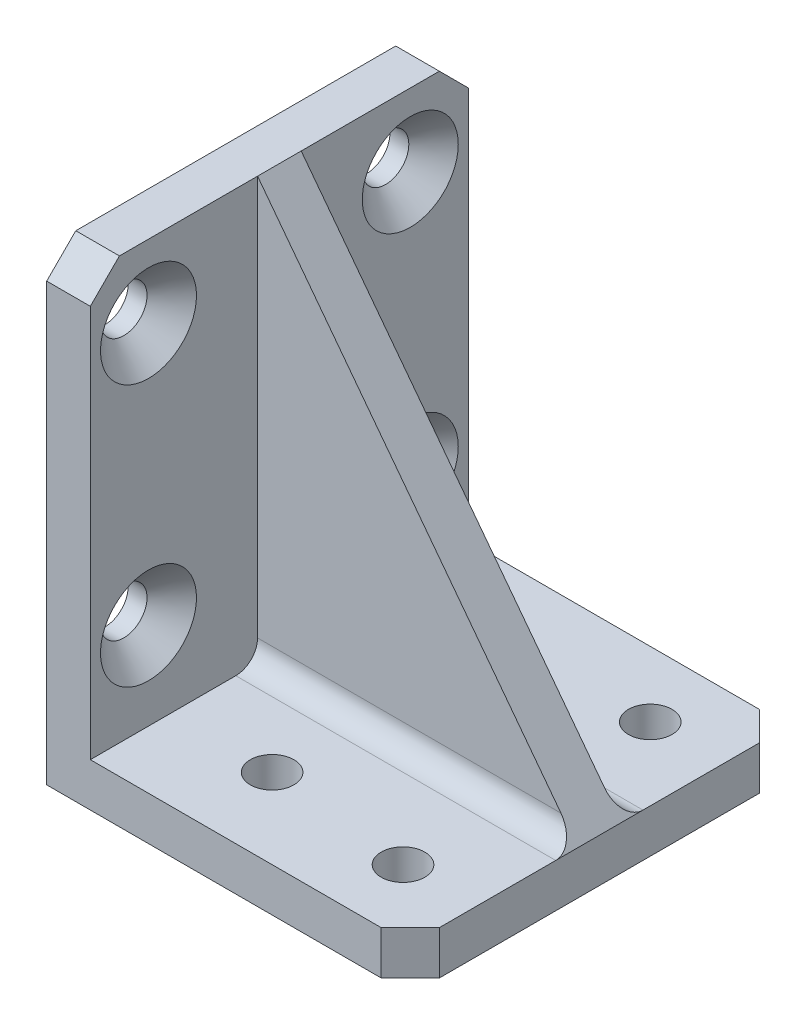
ISO-10303-21;
HEADER;
FILE_DESCRIPTION(('STEP AP214'),'2;1');
FILE_NAME('part.step','',(''),(''),'','','');
FILE_SCHEMA(('AUTOMOTIVE_DESIGN { 1 0 10303 214 1 1 1 1 }'));
ENDSEC;
DATA;
#1=APPLICATION_CONTEXT('core data for automotive mechanical design processes');
#2=APPLICATION_PROTOCOL_DEFINITION('international standard','automotive_design',2000,#1);
#3=PRODUCT_CONTEXT('',#1,'mechanical');
#4=PRODUCT('Part','Part','',(#3));
#5=PRODUCT_RELATED_PRODUCT_CATEGORY('part','',(#4));
#6=PRODUCT_DEFINITION_FORMATION('','',#4);
#7=PRODUCT_DEFINITION_CONTEXT('part definition',#1,'design');
#8=PRODUCT_DEFINITION('design','',#6,#7);
#9=PRODUCT_DEFINITION_SHAPE('','',#8);
#10=(LENGTH_UNIT() NAMED_UNIT(*) SI_UNIT(.MILLI.,.METRE.));
#11=(NAMED_UNIT(*) PLANE_ANGLE_UNIT() SI_UNIT($,.RADIAN.));
#12=(NAMED_UNIT(*) SI_UNIT($,.STERADIAN.) SOLID_ANGLE_UNIT());
#13=UNCERTAINTY_MEASURE_WITH_UNIT(LENGTH_MEASURE(1.E-05),#10,'distance_accuracy_value','');
#14=(GEOMETRIC_REPRESENTATION_CONTEXT(3) GLOBAL_UNCERTAINTY_ASSIGNED_CONTEXT((#13)) GLOBAL_UNIT_ASSIGNED_CONTEXT((#10,
#11,#12)) REPRESENTATION_CONTEXT('',''));
#15=CARTESIAN_POINT('',(0.,0.,0.));
#16=DIRECTION('',(0.,0.,1.));
#17=DIRECTION('',(1.,0.,0.));
#18=AXIS2_PLACEMENT_3D('',#15,#16,#17);
#19=CARTESIAN_POINT('',(25.,3.,13.));
#20=DIRECTION('',(0.,-1.,0.));
#21=DIRECTION('',(1.,0.,0.));
#22=AXIS2_PLACEMENT_3D('',#19,#20,#21);
#23=PLANE('',#22);
#24=CARTESIAN_POINT('',(20.,3.,8.5));
#25=DIRECTION('',(0.,-1.,0.));
#26=DIRECTION('',(1.,0.,0.));
#27=AXIS2_PLACEMENT_3D('',#24,#25,#26);
#28=CIRCLE('',#27,1.5);
#29=CARTESIAN_POINT('',(21.5,3.,8.5));
#30=VERTEX_POINT('',#29);
#31=EDGE_CURVE('E134',#30,#30,#28,.F.);
#32=ORIENTED_EDGE('',*,*,#31,.F.);
#33=EDGE_LOOP('',(#32));
#34=FACE_BOUND('',#33,.T.);
#35=CARTESIAN_POINT('',(10.,3.,7.5));
#36=DIRECTION('',(0.,-1.,0.));
#37=DIRECTION('',(1.,0.,0.));
#38=AXIS2_PLACEMENT_3D('',#35,#36,#37);
#39=CIRCLE('',#38,1.5);
#40=CARTESIAN_POINT('',(11.5,3.,7.5));
#41=VERTEX_POINT('',#40);
#42=EDGE_CURVE('E140',#41,#41,#39,.F.);
#43=ORIENTED_EDGE('',*,*,#42,.F.);
#44=EDGE_LOOP('',(#43));
#45=FACE_BOUND('',#44,.T.);
#46=DIRECTION('',(0.,0.,-1.));
#47=VECTOR('',#46,1.);
#48=CARTESIAN_POINT('',(25.,3.,13.));
#49=LINE('',#48,#47);
#50=CARTESIAN_POINT('',(25.,3.,11.));
#51=VERTEX_POINT('',#50);
#52=CARTESIAN_POINT('',(25.,3.,3.));
#53=VERTEX_POINT('',#52);
#54=EDGE_CURVE('E182',#51,#53,#49,.T.);
#55=ORIENTED_EDGE('',*,*,#54,.T.);
#56=DIRECTION('',(1.,0.,0.));
#57=VECTOR('',#56,1.);
#58=CARTESIAN_POINT('',(3.,3.,3.));
#59=LINE('',#58,#57);
#60=CARTESIAN_POINT('',(3.,3.,3.));
#61=VERTEX_POINT('',#60);
#62=EDGE_CURVE('E57',#53,#61,#59,.F.);
#63=ORIENTED_EDGE('',*,*,#62,.T.);
#64=DIRECTION('',(0.,0.,-1.));
#65=VECTOR('',#64,1.);
#66=CARTESIAN_POINT('',(3.,3.,13.));
#67=LINE('',#66,#65);
#68=CARTESIAN_POINT('',(3.,3.,13.));
#69=VERTEX_POINT('',#68);
#70=EDGE_CURVE('E179',#69,#61,#67,.T.);
#71=ORIENTED_EDGE('',*,*,#70,.F.);
#72=DIRECTION('',(-1.,0.,0.));
#73=VECTOR('',#72,1.);
#74=CARTESIAN_POINT('',(25.,3.,13.));
#75=LINE('',#74,#73);
#76=CARTESIAN_POINT('',(23.,3.,13.));
#77=VERTEX_POINT('',#76);
#78=EDGE_CURVE('E157',#77,#69,#75,.T.);
#79=ORIENTED_EDGE('',*,*,#78,.F.);
#80=DIRECTION('',(0.707106781186546,0.,-0.707106781186549));
#81=VECTOR('',#80,1.);
#82=CARTESIAN_POINT('',(23.,3.,13.));
#83=LINE('',#82,#81);
#84=EDGE_CURVE('E231',#77,#51,#83,.T.);
#85=ORIENTED_EDGE('',*,*,#84,.T.);
#86=EDGE_LOOP('',(#55,#63,#71,#79,#85));
#87=FACE_BOUND('',#86,.T.);
#88=ADVANCED_FACE('F34',(#34,#45,#87),#23,.F.);
#89=CARTESIAN_POINT('',(3.,3.,13.));
#90=DIRECTION('',(-1.,0.,0.));
#91=DIRECTION('',(0.,0.,1.));
#92=AXIS2_PLACEMENT_3D('',#89,#90,#91);
#93=PLANE('',#92);
#94=CARTESIAN_POINT('',(3.,9.,9.));
#95=DIRECTION('',(1.,0.,0.));
#96=DIRECTION('',(0.,0.,-1.));
#97=AXIS2_PLACEMENT_3D('',#94,#95,#96);
#98=CIRCLE('',#97,3.3);
#99=CARTESIAN_POINT('',(3.,9.,5.7));
#100=VERTEX_POINT('',#99);
#101=EDGE_CURVE('E591',#100,#100,#98,.T.);
#102=ORIENTED_EDGE('',*,*,#101,.F.);
#103=EDGE_LOOP('',(#102));
#104=FACE_BOUND('',#103,.T.);
#105=CARTESIAN_POINT('',(3.,27.,9.));
#106=DIRECTION('',(1.,0.,0.));
#107=DIRECTION('',(0.,0.,-1.));
#108=AXIS2_PLACEMENT_3D('',#105,#106,#107);
#109=CIRCLE('',#108,3.3);
#110=CARTESIAN_POINT('',(3.,27.,5.7));
#111=VERTEX_POINT('',#110);
#112=EDGE_CURVE('E600',#111,#111,#109,.T.);
#113=ORIENTED_EDGE('',*,*,#112,.F.);
#114=EDGE_LOOP('',(#113));
#115=FACE_BOUND('',#114,.T.);
#116=ORIENTED_EDGE('',*,*,#70,.T.);
#117=CARTESIAN_POINT('',(3.,4.5,3.));
#118=DIRECTION('',(-1.,0.,0.));
#119=DIRECTION('',(0.,0.,1.));
#120=AXIS2_PLACEMENT_3D('',#117,#118,#119);
#121=CIRCLE('',#120,1.5);
#122=CARTESIAN_POINT('',(3.,4.5,1.5));
#123=VERTEX_POINT('',#122);
#124=EDGE_CURVE('E241',#61,#123,#121,.F.);
#125=ORIENTED_EDGE('',*,*,#124,.T.);
#126=DIRECTION('',(0.,-1.,0.));
#127=VECTOR('',#126,1.);
#128=CARTESIAN_POINT('',(3.,32.,1.5));
#129=LINE('',#128,#127);
#130=CARTESIAN_POINT('',(3.,32.,1.5));
#131=VERTEX_POINT('',#130);
#132=EDGE_CURVE('E104',#131,#123,#129,.T.);
#133=ORIENTED_EDGE('',*,*,#132,.F.);
#134=DIRECTION('',(0.,0.,-1.));
#135=VECTOR('',#134,1.);
#136=CARTESIAN_POINT('',(3.,32.,13.));
#137=LINE('',#136,#135);
#138=CARTESIAN_POINT('',(3.,32.,11.));
#139=VERTEX_POINT('',#138);
#140=EDGE_CURVE('E176',#139,#131,#137,.T.);
#141=ORIENTED_EDGE('',*,*,#140,.F.);
#142=DIRECTION('',(0.,-0.707106781186546,0.707106781186549));
#143=VECTOR('',#142,1.);
#144=CARTESIAN_POINT('',(3.,30.,13.));
#145=LINE('',#144,#143);
#146=CARTESIAN_POINT('',(3.,30.,13.));
#147=VERTEX_POINT('',#146);
#148=EDGE_CURVE('E207',#139,#147,#145,.T.);
#149=ORIENTED_EDGE('',*,*,#148,.T.);
#150=DIRECTION('',(0.,1.,0.));
#151=VECTOR('',#150,1.);
#152=CARTESIAN_POINT('',(3.,3.,13.));
#153=LINE('',#152,#151);
#154=EDGE_CURVE('E160',#69,#147,#153,.T.);
#155=ORIENTED_EDGE('',*,*,#154,.F.);
#156=EDGE_LOOP('',(#116,#125,#133,#141,#149,#155));
#157=FACE_BOUND('',#156,.T.);
#158=ADVANCED_FACE('F315',(#104,#115,#157),#93,.F.);
#159=CARTESIAN_POINT('',(0.,32.,13.));
#160=DIRECTION('',(1.,0.,0.));
#161=DIRECTION('',(0.,1.,0.));
#162=AXIS2_PLACEMENT_3D('',#159,#160,#161);
#163=PLANE('',#162);
#164=CARTESIAN_POINT('',(0.,9.,-9.));
#165=DIRECTION('',(1.,0.,0.));
#166=DIRECTION('',(0.,0.,-1.));
#167=AXIS2_PLACEMENT_3D('',#164,#165,#166);
#168=CIRCLE('',#167,1.6);
#169=CARTESIAN_POINT('',(0.,9.,-10.6));
#170=VERTEX_POINT('',#169);
#171=EDGE_CURVE('E586',#170,#170,#168,.T.);
#172=ORIENTED_EDGE('',*,*,#171,.T.);
#173=EDGE_LOOP('',(#172));
#174=FACE_BOUND('',#173,.T.);
#175=CARTESIAN_POINT('',(0.,9.,9.));
#176=DIRECTION('',(1.,0.,0.));
#177=DIRECTION('',(0.,0.,-1.));
#178=AXIS2_PLACEMENT_3D('',#175,#176,#177);
#179=CIRCLE('',#178,1.6);
#180=CARTESIAN_POINT('',(0.,9.,7.4));
#181=VERTEX_POINT('',#180);
#182=EDGE_CURVE('E597',#181,#181,#179,.T.);
#183=ORIENTED_EDGE('',*,*,#182,.T.);
#184=EDGE_LOOP('',(#183));
#185=FACE_BOUND('',#184,.T.);
#186=CARTESIAN_POINT('',(0.,27.,9.));
#187=DIRECTION('',(1.,0.,0.));
#188=DIRECTION('',(0.,0.,-1.));
#189=AXIS2_PLACEMENT_3D('',#186,#187,#188);
#190=CIRCLE('',#189,1.6);
#191=CARTESIAN_POINT('',(0.,27.,7.4));
#192=VERTEX_POINT('',#191);
#193=EDGE_CURVE('E606',#192,#192,#190,.T.);
#194=ORIENTED_EDGE('',*,*,#193,.T.);
#195=EDGE_LOOP('',(#194));
#196=FACE_BOUND('',#195,.T.);
#197=CARTESIAN_POINT('',(0.,27.,-9.));
#198=DIRECTION('',(1.,0.,0.));
#199=DIRECTION('',(0.,0.,-1.));
#200=AXIS2_PLACEMENT_3D('',#197,#198,#199);
#201=CIRCLE('',#200,1.6);
#202=CARTESIAN_POINT('',(0.,27.,-10.6));
#203=VERTEX_POINT('',#202);
#204=EDGE_CURVE('E119',#203,#203,#201,.T.);
#205=ORIENTED_EDGE('',*,*,#204,.T.);
#206=EDGE_LOOP('',(#205));
#207=FACE_BOUND('',#206,.T.);
#208=DIRECTION('',(0.,-1.,0.));
#209=VECTOR('',#208,1.);
#210=CARTESIAN_POINT('',(0.,32.,13.));
#211=LINE('',#210,#209);
#212=CARTESIAN_POINT('',(0.,30.,13.));
#213=VERTEX_POINT('',#212);
#214=CARTESIAN_POINT('',(0.,0.,13.));
#215=VERTEX_POINT('',#214);
#216=EDGE_CURVE('E150',#213,#215,#211,.T.);
#217=ORIENTED_EDGE('',*,*,#216,.F.);
#218=DIRECTION('',(0.,0.707106781186546,-0.707106781186549));
#219=VECTOR('',#218,1.);
#220=CARTESIAN_POINT('',(0.,30.,13.));
#221=LINE('',#220,#219);
#222=CARTESIAN_POINT('',(0.,32.,11.));
#223=VERTEX_POINT('',#222);
#224=EDGE_CURVE('E198',#213,#223,#221,.T.);
#225=ORIENTED_EDGE('',*,*,#224,.T.);
#226=DIRECTION('',(0.,0.,-1.));
#227=VECTOR('',#226,1.);
#228=CARTESIAN_POINT('',(0.,32.,13.));
#229=LINE('',#228,#227);
#230=CARTESIAN_POINT('',(0.,32.,-11.));
#231=VERTEX_POINT('',#230);
#232=EDGE_CURVE('E163',#223,#231,#229,.T.);
#233=ORIENTED_EDGE('',*,*,#232,.T.);
#234=DIRECTION('',(0.,0.707106781186549,0.707106781186546));
#235=VECTOR('',#234,1.);
#236=CARTESIAN_POINT('',(0.,32.,-11.));
#237=LINE('',#236,#235);
#238=CARTESIAN_POINT('',(0.,30.,-13.));
#239=VERTEX_POINT('',#238);
#240=EDGE_CURVE('E195',#231,#239,#237,.F.);
#241=ORIENTED_EDGE('',*,*,#240,.T.);
#242=DIRECTION('',(0.,-1.,0.));
#243=VECTOR('',#242,1.);
#244=CARTESIAN_POINT('',(0.,32.,-13.));
#245=LINE('',#244,#243);
#246=CARTESIAN_POINT('',(0.,0.,-13.));
#247=VERTEX_POINT('',#246);
#248=EDGE_CURVE('E149',#239,#247,#245,.T.);
#249=ORIENTED_EDGE('',*,*,#248,.T.);
#250=DIRECTION('',(0.,0.,-1.));
#251=VECTOR('',#250,1.);
#252=CARTESIAN_POINT('',(0.,0.,13.));
#253=LINE('',#252,#251);
#254=EDGE_CURVE('E186',#215,#247,#253,.T.);
#255=ORIENTED_EDGE('',*,*,#254,.F.);
#256=EDGE_LOOP('',(#217,#225,#233,#241,#249,#255));
#257=FACE_BOUND('',#256,.T.);
#258=ADVANCED_FACE('F294',(#174,#185,#196,#207,#257),#163,.F.);
#259=CARTESIAN_POINT('',(0.,0.,13.));
#260=DIRECTION('',(0.,1.,0.));
#261=DIRECTION('',(0.,0.,1.));
#262=AXIS2_PLACEMENT_3D('',#259,#260,#261);
#263=PLANE('',#262);
#264=CARTESIAN_POINT('',(20.,0.,-8.5));
#265=DIRECTION('',(0.,-1.,0.));
#266=DIRECTION('',(0.,0.,-1.));
#267=AXIS2_PLACEMENT_3D('',#264,#265,#266);
#268=CIRCLE('',#267,1.5);
#269=CARTESIAN_POINT('',(20.,0.,-10.));
#270=VERTEX_POINT('',#269);
#271=EDGE_CURVE('E125',#270,#270,#268,.T.);
#272=ORIENTED_EDGE('',*,*,#271,.F.);
#273=EDGE_LOOP('',(#272));
#274=FACE_BOUND('',#273,.T.);
#275=CARTESIAN_POINT('',(20.,0.,8.5));
#276=DIRECTION('',(0.,-1.,0.));
#277=DIRECTION('',(0.,0.,-1.));
#278=AXIS2_PLACEMENT_3D('',#275,#276,#277);
#279=CIRCLE('',#278,1.5);
#280=CARTESIAN_POINT('',(20.,0.,7.));
#281=VERTEX_POINT('',#280);
#282=EDGE_CURVE('E131',#281,#281,#279,.T.);
#283=ORIENTED_EDGE('',*,*,#282,.F.);
#284=EDGE_LOOP('',(#283));
#285=FACE_BOUND('',#284,.T.);
#286=CARTESIAN_POINT('',(10.,0.,7.5));
#287=DIRECTION('',(0.,-1.,0.));
#288=DIRECTION('',(0.,0.,-1.));
#289=AXIS2_PLACEMENT_3D('',#286,#287,#288);
#290=CIRCLE('',#289,1.5);
#291=CARTESIAN_POINT('',(10.,0.,6.));
#292=VERTEX_POINT('',#291);
#293=EDGE_CURVE('E137',#292,#292,#290,.T.);
#294=ORIENTED_EDGE('',*,*,#293,.F.);
#295=EDGE_LOOP('',(#294));
#296=FACE_BOUND('',#295,.T.);
#297=CARTESIAN_POINT('',(10.,0.,-7.5));
#298=DIRECTION('',(0.,-1.,0.));
#299=DIRECTION('',(0.,0.,-1.));
#300=AXIS2_PLACEMENT_3D('',#297,#298,#299);
#301=CIRCLE('',#300,1.5);
#302=CARTESIAN_POINT('',(10.,0.,-9.));
#303=VERTEX_POINT('',#302);
#304=EDGE_CURVE('E143',#303,#303,#301,.T.);
#305=ORIENTED_EDGE('',*,*,#304,.F.);
#306=EDGE_LOOP('',(#305));
#307=FACE_BOUND('',#306,.T.);
#308=DIRECTION('',(1.,0.,0.));
#309=VECTOR('',#308,1.);
#310=CARTESIAN_POINT('',(0.,0.,-13.));
#311=LINE('',#310,#309);
#312=CARTESIAN_POINT('',(23.,0.,-13.));
#313=VERTEX_POINT('',#312);
#314=EDGE_CURVE('E166',#247,#313,#311,.T.);
#315=ORIENTED_EDGE('',*,*,#314,.T.);
#316=DIRECTION('',(-0.707106781186549,0.,-0.707106781186546));
#317=VECTOR('',#316,1.);
#318=CARTESIAN_POINT('',(25.,0.,-11.));
#319=LINE('',#318,#317);
#320=CARTESIAN_POINT('',(25.,0.,-11.));
#321=VERTEX_POINT('',#320);
#322=EDGE_CURVE('E79',#313,#321,#319,.F.);
#323=ORIENTED_EDGE('',*,*,#322,.T.);
#324=DIRECTION('',(0.,0.,-1.));
#325=VECTOR('',#324,1.);
#326=CARTESIAN_POINT('',(25.,0.,13.));
#327=LINE('',#326,#325);
#328=CARTESIAN_POINT('',(25.,0.,11.));
#329=VERTEX_POINT('',#328);
#330=EDGE_CURVE('E184',#329,#321,#327,.T.);
#331=ORIENTED_EDGE('',*,*,#330,.F.);
#332=DIRECTION('',(-0.707106781186546,0.,0.707106781186549));
#333=VECTOR('',#332,1.);
#334=CARTESIAN_POINT('',(23.,0.,13.));
#335=LINE('',#334,#333);
#336=CARTESIAN_POINT('',(23.,0.,13.));
#337=VERTEX_POINT('',#336);
#338=EDGE_CURVE('E227',#329,#337,#335,.T.);
#339=ORIENTED_EDGE('',*,*,#338,.T.);
#340=DIRECTION('',(1.,0.,0.));
#341=VECTOR('',#340,1.);
#342=CARTESIAN_POINT('',(0.,0.,13.));
#343=LINE('',#342,#341);
#344=EDGE_CURVE('E153',#215,#337,#343,.T.);
#345=ORIENTED_EDGE('',*,*,#344,.F.);
#346=ORIENTED_EDGE('',*,*,#254,.T.);
#347=EDGE_LOOP('',(#315,#323,#331,#339,#345,#346));
#348=FACE_BOUND('',#347,.T.);
#349=ADVANCED_FACE('F338',(#274,#285,#296,#307,#348),#263,.F.);
#350=CARTESIAN_POINT('',(25.,0.,13.));
#351=DIRECTION('',(-1.,0.,0.));
#352=DIRECTION('',(0.,0.,1.));
#353=AXIS2_PLACEMENT_3D('',#350,#351,#352);
#354=PLANE('',#353);
#355=ORIENTED_EDGE('',*,*,#330,.T.);
#356=DIRECTION('',(0.,1.,0.));
#357=VECTOR('',#356,1.);
#358=CARTESIAN_POINT('',(25.,0.,-11.));
#359=LINE('',#358,#357);
#360=CARTESIAN_POINT('',(25.,3.,-11.));
#361=VERTEX_POINT('',#360);
#362=EDGE_CURVE('E221',#321,#361,#359,.T.);
#363=ORIENTED_EDGE('',*,*,#362,.T.);
#364=CARTESIAN_POINT('',(25.,3.,-3.));
#365=VERTEX_POINT('',#364);
#366=EDGE_CURVE('E181',#365,#361,#49,.T.);
#367=ORIENTED_EDGE('',*,*,#366,.F.);
#368=DIRECTION('',(0.,0.,-1.));
#369=VECTOR('',#368,1.);
#370=CARTESIAN_POINT('',(25.,3.,1.5));
#371=LINE('',#370,#369);
#372=EDGE_CURVE('E49',#53,#365,#371,.T.);
#373=ORIENTED_EDGE('',*,*,#372,.F.);
#374=ORIENTED_EDGE('',*,*,#54,.F.);
#375=DIRECTION('',(0.,-1.,0.));
#376=VECTOR('',#375,1.);
#377=CARTESIAN_POINT('',(25.,0.,11.));
#378=LINE('',#377,#376);
#379=EDGE_CURVE('E219',#51,#329,#378,.T.);
#380=ORIENTED_EDGE('',*,*,#379,.T.);
#381=EDGE_LOOP('',(#355,#363,#367,#373,#374,#380));
#382=FACE_BOUND('',#381,.T.);
#383=ADVANCED_FACE('F335',(#382),#354,.F.);
#384=CARTESIAN_POINT('',(20.,3.,-8.5));
#385=DIRECTION('',(0.,-1.,0.));
#386=DIRECTION('',(1.,0.,0.));
#387=AXIS2_PLACEMENT_3D('',#384,#385,#386);
#388=CIRCLE('',#387,1.5);
#389=CARTESIAN_POINT('',(21.5,3.,-8.5));
#390=VERTEX_POINT('',#389);
#391=EDGE_CURVE('E128',#390,#390,#388,.F.);
#392=ORIENTED_EDGE('',*,*,#391,.F.);
#393=EDGE_LOOP('',(#392));
#394=FACE_BOUND('',#393,.T.);
#395=CARTESIAN_POINT('',(10.,3.,-7.5));
#396=DIRECTION('',(0.,-1.,0.));
#397=DIRECTION('',(1.,0.,0.));
#398=AXIS2_PLACEMENT_3D('',#395,#396,#397);
#399=CIRCLE('',#398,1.5);
#400=CARTESIAN_POINT('',(11.5,3.,-7.5));
#401=VERTEX_POINT('',#400);
#402=EDGE_CURVE('E146',#401,#401,#399,.F.);
#403=ORIENTED_EDGE('',*,*,#402,.F.);
#404=EDGE_LOOP('',(#403));
#405=FACE_BOUND('',#404,.T.);
#406=CARTESIAN_POINT('',(3.,3.,-2.99999999999999));
#407=VERTEX_POINT('',#406);
#408=CARTESIAN_POINT('',(3.,3.,-13.));
#409=VERTEX_POINT('',#408);
#410=EDGE_CURVE('E178',#407,#409,#67,.T.);
#411=ORIENTED_EDGE('',*,*,#410,.F.);
#412=DIRECTION('',(1.,0.,0.));
#413=VECTOR('',#412,1.);
#414=CARTESIAN_POINT('',(25.,3.,-3.));
#415=LINE('',#414,#413);
#416=EDGE_CURVE('E234',#407,#365,#415,.T.);
#417=ORIENTED_EDGE('',*,*,#416,.T.);
#418=ORIENTED_EDGE('',*,*,#366,.T.);
#419=DIRECTION('',(0.707106781186549,0.,0.707106781186546));
#420=VECTOR('',#419,1.);
#421=CARTESIAN_POINT('',(25.,3.,-11.));
#422=LINE('',#421,#420);
#423=CARTESIAN_POINT('',(23.,3.,-13.));
#424=VERTEX_POINT('',#423);
#425=EDGE_CURVE('E224',#361,#424,#422,.F.);
#426=ORIENTED_EDGE('',*,*,#425,.T.);
#427=DIRECTION('',(-1.,0.,0.));
#428=VECTOR('',#427,1.);
#429=CARTESIAN_POINT('',(25.,3.,-13.));
#430=LINE('',#429,#428);
#431=EDGE_CURVE('E168',#424,#409,#430,.T.);
#432=ORIENTED_EDGE('',*,*,#431,.T.);
#433=EDGE_LOOP('',(#411,#417,#418,#426,#432));
#434=FACE_BOUND('',#433,.T.);
#435=ADVANCED_FACE('F259',(#394,#405,#434),#23,.F.);
#436=CARTESIAN_POINT('',(3.,9.,-9.));
#437=DIRECTION('',(1.,0.,0.));
#438=DIRECTION('',(0.,0.,-1.));
#439=AXIS2_PLACEMENT_3D('',#436,#437,#438);
#440=CIRCLE('',#439,3.3);
#441=CARTESIAN_POINT('',(3.,9.,-12.3));
#442=VERTEX_POINT('',#441);
#443=EDGE_CURVE('E584',#442,#442,#440,.T.);
#444=ORIENTED_EDGE('',*,*,#443,.F.);
#445=EDGE_LOOP('',(#444));
#446=FACE_BOUND('',#445,.T.);
#447=CARTESIAN_POINT('',(3.,27.,-9.));
#448=DIRECTION('',(1.,0.,0.));
#449=DIRECTION('',(0.,0.,-1.));
#450=AXIS2_PLACEMENT_3D('',#447,#448,#449);
#451=CIRCLE('',#450,3.3);
#452=CARTESIAN_POINT('',(3.,27.,-12.3));
#453=VERTEX_POINT('',#452);
#454=EDGE_CURVE('E609',#453,#453,#451,.T.);
#455=ORIENTED_EDGE('',*,*,#454,.F.);
#456=EDGE_LOOP('',(#455));
#457=FACE_BOUND('',#456,.T.);
#458=DIRECTION('',(0.,-1.,0.));
#459=VECTOR('',#458,1.);
#460=CARTESIAN_POINT('',(3.,32.,-1.5));
#461=LINE('',#460,#459);
#462=CARTESIAN_POINT('',(3.,32.,-1.5));
#463=VERTEX_POINT('',#462);
#464=CARTESIAN_POINT('',(3.,4.5,-1.5));
#465=VERTEX_POINT('',#464);
#466=EDGE_CURVE('E112',#463,#465,#461,.T.);
#467=ORIENTED_EDGE('',*,*,#466,.T.);
#468=CARTESIAN_POINT('',(3.,4.5,-3.));
#469=DIRECTION('',(-1.,0.,0.));
#470=DIRECTION('',(0.,0.,1.));
#471=AXIS2_PLACEMENT_3D('',#468,#469,#470);
#472=CIRCLE('',#471,1.5);
#473=EDGE_CURVE('E105',#465,#407,#472,.F.);
#474=ORIENTED_EDGE('',*,*,#473,.T.);
#475=ORIENTED_EDGE('',*,*,#410,.T.);
#476=DIRECTION('',(0.,1.,0.));
#477=VECTOR('',#476,1.);
#478=CARTESIAN_POINT('',(3.,3.,-13.));
#479=LINE('',#478,#477);
#480=CARTESIAN_POINT('',(3.,30.,-13.));
#481=VERTEX_POINT('',#480);
#482=EDGE_CURVE('E154',#409,#481,#479,.T.);
#483=ORIENTED_EDGE('',*,*,#482,.T.);
#484=DIRECTION('',(0.,-0.707106781186549,-0.707106781186546));
#485=VECTOR('',#484,1.);
#486=CARTESIAN_POINT('',(3.,32.,-11.));
#487=LINE('',#486,#485);
#488=CARTESIAN_POINT('',(3.,32.,-11.));
#489=VERTEX_POINT('',#488);
#490=EDGE_CURVE('E216',#481,#489,#487,.F.);
#491=ORIENTED_EDGE('',*,*,#490,.T.);
#492=EDGE_CURVE('E175',#463,#489,#137,.T.);
#493=ORIENTED_EDGE('',*,*,#492,.F.);
#494=EDGE_LOOP('',(#467,#474,#475,#483,#491,#493));
#495=FACE_BOUND('',#494,.T.);
#496=ADVANCED_FACE('F256',(#446,#457,#495),#93,.F.);
#497=CARTESIAN_POINT('',(3.,32.,13.));
#498=DIRECTION('',(0.,-1.,0.));
#499=DIRECTION('',(0.,0.,-1.));
#500=AXIS2_PLACEMENT_3D('',#497,#498,#499);
#501=PLANE('',#500);
#502=ORIENTED_EDGE('',*,*,#232,.F.);
#503=DIRECTION('',(1.,0.,0.));
#504=VECTOR('',#503,1.);
#505=CARTESIAN_POINT('',(3.,32.,11.));
#506=LINE('',#505,#504);
#507=EDGE_CURVE('E204',#223,#139,#506,.T.);
#508=ORIENTED_EDGE('',*,*,#507,.T.);
#509=ORIENTED_EDGE('',*,*,#140,.T.);
#510=DIRECTION('',(0.,0.,-1.));
#511=VECTOR('',#510,1.);
#512=CARTESIAN_POINT('',(3.,32.,1.5));
#513=LINE('',#512,#511);
#514=EDGE_CURVE('E111',#131,#463,#513,.T.);
#515=ORIENTED_EDGE('',*,*,#514,.T.);
#516=ORIENTED_EDGE('',*,*,#492,.T.);
#517=DIRECTION('',(-1.,0.,0.));
#518=VECTOR('',#517,1.);
#519=CARTESIAN_POINT('',(3.,32.,-11.));
#520=LINE('',#519,#518);
#521=EDGE_CURVE('E201',#489,#231,#520,.T.);
#522=ORIENTED_EDGE('',*,*,#521,.T.);
#523=EDGE_LOOP('',(#502,#508,#509,#515,#516,#522));
#524=FACE_BOUND('',#523,.T.);
#525=ADVANCED_FACE('F288',(#524),#501,.F.);
#526=CARTESIAN_POINT('',(0.,0.,13.));
#527=DIRECTION('',(0.,0.,1.));
#528=DIRECTION('',(1.,0.,0.));
#529=AXIS2_PLACEMENT_3D('',#526,#527,#528);
#530=PLANE('',#529);
#531=ORIENTED_EDGE('',*,*,#154,.T.);
#532=DIRECTION('',(-1.,0.,0.));
#533=VECTOR('',#532,1.);
#534=CARTESIAN_POINT('',(0.,30.,13.));
#535=LINE('',#534,#533);
#536=EDGE_CURVE('E192',#147,#213,#535,.T.);
#537=ORIENTED_EDGE('',*,*,#536,.T.);
#538=ORIENTED_EDGE('',*,*,#216,.T.);
#539=ORIENTED_EDGE('',*,*,#344,.T.);
#540=DIRECTION('',(0.,1.,0.));
#541=VECTOR('',#540,1.);
#542=CARTESIAN_POINT('',(23.,3.,13.));
#543=LINE('',#542,#541);
#544=EDGE_CURVE('E189',#337,#77,#543,.T.);
#545=ORIENTED_EDGE('',*,*,#544,.T.);
#546=ORIENTED_EDGE('',*,*,#78,.T.);
#547=EDGE_LOOP('',(#531,#537,#538,#539,#545,#546));
#548=FACE_BOUND('',#547,.T.);
#549=ADVANCED_FACE('F307',(#548),#530,.T.);
#550=CARTESIAN_POINT('',(0.,0.,-13.));
#551=DIRECTION('',(0.,0.,1.));
#552=DIRECTION('',(1.,0.,0.));
#553=AXIS2_PLACEMENT_3D('',#550,#551,#552);
#554=PLANE('',#553);
#555=ORIENTED_EDGE('',*,*,#248,.F.);
#556=DIRECTION('',(1.,0.,0.));
#557=VECTOR('',#556,1.);
#558=CARTESIAN_POINT('',(0.,30.,-13.));
#559=LINE('',#558,#557);
#560=EDGE_CURVE('E213',#239,#481,#559,.T.);
#561=ORIENTED_EDGE('',*,*,#560,.T.);
#562=ORIENTED_EDGE('',*,*,#482,.F.);
#563=ORIENTED_EDGE('',*,*,#431,.F.);
#564=DIRECTION('',(0.,-1.,0.));
#565=VECTOR('',#564,1.);
#566=CARTESIAN_POINT('',(23.,0.,-13.));
#567=LINE('',#566,#565);
#568=EDGE_CURVE('E210',#424,#313,#567,.T.);
#569=ORIENTED_EDGE('',*,*,#568,.T.);
#570=ORIENTED_EDGE('',*,*,#314,.F.);
#571=EDGE_LOOP('',(#555,#561,#562,#563,#569,#570));
#572=FACE_BOUND('',#571,.T.);
#573=ADVANCED_FACE('F271',(#572),#554,.F.);
#574=CARTESIAN_POINT('',(10.,7.24264068711929,-7.5));
#575=DIRECTION('',(0.,-1.,0.));
#576=DIRECTION('',(0.,0.,-1.));
#577=AXIS2_PLACEMENT_3D('',#574,#575,#576);
#578=CYLINDRICAL_SURFACE('',#577,1.5);
#579=ORIENTED_EDGE('',*,*,#402,.T.);
#580=EDGE_LOOP('',(#579));
#581=FACE_BOUND('',#580,.T.);
#582=ORIENTED_EDGE('',*,*,#304,.T.);
#583=EDGE_LOOP('',(#582));
#584=FACE_BOUND('',#583,.T.);
#585=ADVANCED_FACE('F373',(#581,#584),#578,.F.);
#586=CARTESIAN_POINT('',(10.,7.24264068711929,7.5));
#587=DIRECTION('',(0.,-1.,0.));
#588=DIRECTION('',(0.,0.,-1.));
#589=AXIS2_PLACEMENT_3D('',#586,#587,#588);
#590=CYLINDRICAL_SURFACE('',#589,1.5);
#591=ORIENTED_EDGE('',*,*,#42,.T.);
#592=EDGE_LOOP('',(#591));
#593=FACE_BOUND('',#592,.T.);
#594=ORIENTED_EDGE('',*,*,#293,.T.);
#595=EDGE_LOOP('',(#594));
#596=FACE_BOUND('',#595,.T.);
#597=ADVANCED_FACE('F376',(#593,#596),#590,.F.);
#598=CARTESIAN_POINT('',(20.,7.24264068711929,8.5));
#599=DIRECTION('',(0.,-1.,0.));
#600=DIRECTION('',(0.,0.,-1.));
#601=AXIS2_PLACEMENT_3D('',#598,#599,#600);
#602=CYLINDRICAL_SURFACE('',#601,1.5);
#603=ORIENTED_EDGE('',*,*,#31,.T.);
#604=EDGE_LOOP('',(#603));
#605=FACE_BOUND('',#604,.T.);
#606=ORIENTED_EDGE('',*,*,#282,.T.);
#607=EDGE_LOOP('',(#606));
#608=FACE_BOUND('',#607,.T.);
#609=ADVANCED_FACE('F407',(#605,#608),#602,.F.);
#610=CARTESIAN_POINT('',(20.,7.24264068711929,-8.5));
#611=DIRECTION('',(0.,-1.,0.));
#612=DIRECTION('',(0.,0.,-1.));
#613=AXIS2_PLACEMENT_3D('',#610,#611,#612);
#614=CYLINDRICAL_SURFACE('',#613,1.5);
#615=ORIENTED_EDGE('',*,*,#391,.T.);
#616=EDGE_LOOP('',(#615));
#617=FACE_BOUND('',#616,.T.);
#618=ORIENTED_EDGE('',*,*,#271,.T.);
#619=EDGE_LOOP('',(#618));
#620=FACE_BOUND('',#619,.T.);
#621=ADVANCED_FACE('F404',(#617,#620),#614,.F.);
#622=CARTESIAN_POINT('',(25.,3.,1.5));
#623=DIRECTION('',(-0.796691270902396,-0.604386481374232,0.));
#624=DIRECTION('',(0.604386481374232,-0.796691270902396,0.));
#625=AXIS2_PLACEMENT_3D('',#622,#623,#624);
#626=PLANE('',#625);
#627=ORIENTED_EDGE('',*,*,#372,.T.);
#628=CARTESIAN_POINT('',(23.8620689655172,4.5,-3.));
#629=DIRECTION('',(-0.796691270902396,-0.604386481374232,0.));
#630=DIRECTION('',(0.604386481374232,-0.796691270902396,0.));
#631=AXIS2_PLACEMENT_3D('',#628,#629,#630);
#632=ELLIPSE('',#631,1.88278704033117,1.5);
#633=CARTESIAN_POINT('',(23.8620689655172,4.5,-1.5));
#634=VERTEX_POINT('',#633);
#635=EDGE_CURVE('E42',#365,#634,#632,.T.);
#636=ORIENTED_EDGE('',*,*,#635,.T.);
#637=DIRECTION('',(-0.604386481374232,0.796691270902396,0.));
#638=VECTOR('',#637,1.);
#639=CARTESIAN_POINT('',(25.,3.,-1.5));
#640=LINE('',#639,#638);
#641=EDGE_CURVE('E116',#634,#463,#640,.T.);
#642=ORIENTED_EDGE('',*,*,#641,.T.);
#643=ORIENTED_EDGE('',*,*,#514,.F.);
#644=DIRECTION('',(-0.604386481374232,0.796691270902396,0.));
#645=VECTOR('',#644,1.);
#646=CARTESIAN_POINT('',(25.,3.,1.5));
#647=LINE('',#646,#645);
#648=CARTESIAN_POINT('',(23.8620689655172,4.5,1.5));
#649=VERTEX_POINT('',#648);
#650=EDGE_CURVE('E101',#649,#131,#647,.T.);
#651=ORIENTED_EDGE('',*,*,#650,.F.);
#652=CARTESIAN_POINT('',(23.8620689655172,4.5,3.));
#653=DIRECTION('',(-0.796691270902396,-0.604386481374232,0.));
#654=DIRECTION('',(-0.604386481374232,0.796691270902396,0.));
#655=AXIS2_PLACEMENT_3D('',#652,#653,#654);
#656=ELLIPSE('',#655,1.88278704033117,1.5);
#657=EDGE_CURVE('E11',#649,#53,#656,.T.);
#658=ORIENTED_EDGE('',*,*,#657,.T.);
#659=EDGE_LOOP('',(#627,#636,#642,#643,#651,#658));
#660=FACE_BOUND('',#659,.T.);
#661=ADVANCED_FACE('F108',(#660),#626,.F.);
#662=CARTESIAN_POINT('',(0.,0.,1.5));
#663=DIRECTION('',(0.,0.,-1.));
#664=DIRECTION('',(-1.,0.,0.));
#665=AXIS2_PLACEMENT_3D('',#662,#663,#664);
#666=PLANE('',#665);
#667=ORIENTED_EDGE('',*,*,#132,.T.);
#668=DIRECTION('',(1.,0.,0.));
#669=VECTOR('',#668,1.);
#670=CARTESIAN_POINT('',(25.,4.5,1.5));
#671=LINE('',#670,#669);
#672=EDGE_CURVE('E94',#123,#649,#671,.T.);
#673=ORIENTED_EDGE('',*,*,#672,.T.);
#674=ORIENTED_EDGE('',*,*,#650,.T.);
#675=EDGE_LOOP('',(#667,#673,#674));
#676=FACE_BOUND('',#675,.T.);
#677=ADVANCED_FACE('F99',(#676),#666,.F.);
#678=CARTESIAN_POINT('',(0.,0.,-1.5));
#679=DIRECTION('',(0.,0.,-1.));
#680=DIRECTION('',(-1.,0.,0.));
#681=AXIS2_PLACEMENT_3D('',#678,#679,#680);
#682=PLANE('',#681);
#683=ORIENTED_EDGE('',*,*,#641,.F.);
#684=DIRECTION('',(1.,0.,0.));
#685=VECTOR('',#684,1.);
#686=CARTESIAN_POINT('',(0.,4.5,-1.5));
#687=LINE('',#686,#685);
#688=EDGE_CURVE('E237',#634,#465,#687,.F.);
#689=ORIENTED_EDGE('',*,*,#688,.T.);
#690=ORIENTED_EDGE('',*,*,#466,.F.);
#691=EDGE_LOOP('',(#683,#689,#690));
#692=FACE_BOUND('',#691,.T.);
#693=ADVANCED_FACE('F249',(#692),#682,.T.);
#694=CARTESIAN_POINT('',(0.,30.,13.));
#695=DIRECTION('',(0.,0.707106781186549,0.707106781186546));
#696=DIRECTION('',(1.,0.,0.));
#697=AXIS2_PLACEMENT_3D('',#694,#695,#696);
#698=PLANE('',#697);
#699=ORIENTED_EDGE('',*,*,#148,.F.);
#700=ORIENTED_EDGE('',*,*,#507,.F.);
#701=ORIENTED_EDGE('',*,*,#224,.F.);
#702=ORIENTED_EDGE('',*,*,#536,.F.);
#703=EDGE_LOOP('',(#699,#700,#701,#702));
#704=FACE_BOUND('',#703,.T.);
#705=ADVANCED_FACE('F302',(#704),#698,.T.);
#706=CARTESIAN_POINT('',(3.,32.,-11.));
#707=DIRECTION('',(0.,-0.707106781186546,0.707106781186549));
#708=DIRECTION('',(-1.,0.,0.));
#709=AXIS2_PLACEMENT_3D('',#706,#707,#708);
#710=PLANE('',#709);
#711=ORIENTED_EDGE('',*,*,#490,.F.);
#712=ORIENTED_EDGE('',*,*,#560,.F.);
#713=ORIENTED_EDGE('',*,*,#240,.F.);
#714=ORIENTED_EDGE('',*,*,#521,.F.);
#715=EDGE_LOOP('',(#711,#712,#713,#714));
#716=FACE_BOUND('',#715,.T.);
#717=ADVANCED_FACE('F280',(#716),#710,.F.);
#718=CARTESIAN_POINT('',(25.,0.,-11.));
#719=DIRECTION('',(-0.707106781186546,0.,0.707106781186549));
#720=DIRECTION('',(0.,1.,0.));
#721=AXIS2_PLACEMENT_3D('',#718,#719,#720);
#722=PLANE('',#721);
#723=ORIENTED_EDGE('',*,*,#322,.F.);
#724=ORIENTED_EDGE('',*,*,#568,.F.);
#725=ORIENTED_EDGE('',*,*,#425,.F.);
#726=ORIENTED_EDGE('',*,*,#362,.F.);
#727=EDGE_LOOP('',(#723,#724,#725,#726));
#728=FACE_BOUND('',#727,.T.);
#729=ADVANCED_FACE('F341',(#728),#722,.F.);
#730=CARTESIAN_POINT('',(23.,0.,13.));
#731=DIRECTION('',(0.707106781186549,0.,0.707106781186546));
#732=DIRECTION('',(0.,-1.,0.));
#733=AXIS2_PLACEMENT_3D('',#730,#731,#732);
#734=PLANE('',#733);
#735=ORIENTED_EDGE('',*,*,#338,.F.);
#736=ORIENTED_EDGE('',*,*,#379,.F.);
#737=ORIENTED_EDGE('',*,*,#84,.F.);
#738=ORIENTED_EDGE('',*,*,#544,.F.);
#739=EDGE_LOOP('',(#735,#736,#737,#738));
#740=FACE_BOUND('',#739,.T.);
#741=ADVANCED_FACE('F337',(#740),#734,.T.);
#742=CARTESIAN_POINT('',(25.,4.5,-3.));
#743=DIRECTION('',(1.,0.,0.));
#744=DIRECTION('',(0.,1.,0.));
#745=AXIS2_PLACEMENT_3D('',#742,#743,#744);
#746=CYLINDRICAL_SURFACE('',#745,1.5);
#747=ORIENTED_EDGE('',*,*,#473,.F.);
#748=ORIENTED_EDGE('',*,*,#688,.F.);
#749=ORIENTED_EDGE('',*,*,#635,.F.);
#750=ORIENTED_EDGE('',*,*,#416,.F.);
#751=EDGE_LOOP('',(#747,#748,#749,#750));
#752=FACE_BOUND('',#751,.T.);
#753=ADVANCED_FACE('F252',(#752),#746,.F.);
#754=CARTESIAN_POINT('',(0.,4.5,3.));
#755=DIRECTION('',(-1.,0.,0.));
#756=DIRECTION('',(0.,-1.,0.));
#757=AXIS2_PLACEMENT_3D('',#754,#755,#756);
#758=CYLINDRICAL_SURFACE('',#757,1.5);
#759=ORIENTED_EDGE('',*,*,#124,.F.);
#760=ORIENTED_EDGE('',*,*,#62,.F.);
#761=ORIENTED_EDGE('',*,*,#657,.F.);
#762=ORIENTED_EDGE('',*,*,#672,.F.);
#763=EDGE_LOOP('',(#759,#760,#761,#762));
#764=FACE_BOUND('',#763,.T.);
#765=ADVANCED_FACE('F36',(#764),#758,.F.);
#766=CARTESIAN_POINT('',(3.,27.,-9.));
#767=DIRECTION('',(1.,0.,0.));
#768=DIRECTION('',(0.,0.,-1.));
#769=AXIS2_PLACEMENT_3D('',#766,#767,#768);
#770=CYLINDRICAL_SURFACE('',#769,1.6);
#771=ORIENTED_EDGE('',*,*,#204,.F.);
#772=EDGE_LOOP('',(#771));
#773=FACE_BOUND('',#772,.T.);
#774=CARTESIAN_POINT('',(1.3,27.,-9.));
#775=DIRECTION('',(1.,0.,0.));
#776=DIRECTION('',(0.,0.,-1.));
#777=AXIS2_PLACEMENT_3D('',#774,#775,#776);
#778=CIRCLE('',#777,1.6);
#779=CARTESIAN_POINT('',(1.3,27.,-10.6));
#780=VERTEX_POINT('',#779);
#781=EDGE_CURVE('E611',#780,#780,#778,.T.);
#782=ORIENTED_EDGE('',*,*,#781,.T.);
#783=EDGE_LOOP('',(#782));
#784=FACE_BOUND('',#783,.T.);
#785=ADVANCED_FACE('F478',(#773,#784),#770,.F.);
#786=CARTESIAN_POINT('',(3.,27.,-9.));
#787=DIRECTION('',(1.,0.,0.));
#788=DIRECTION('',(0.,0.,-1.));
#789=AXIS2_PLACEMENT_3D('',#786,#787,#788);
#790=CONICAL_SURFACE('',#789,3.3,0.785398163397448);
#791=ORIENTED_EDGE('',*,*,#781,.F.);
#792=EDGE_LOOP('',(#791));
#793=FACE_BOUND('',#792,.T.);
#794=ORIENTED_EDGE('',*,*,#454,.T.);
#795=EDGE_LOOP('',(#794));
#796=FACE_BOUND('',#795,.T.);
#797=ADVANCED_FACE('F505',(#793,#796),#790,.F.);
#798=CARTESIAN_POINT('',(3.,27.,9.));
#799=DIRECTION('',(1.,0.,0.));
#800=DIRECTION('',(0.,0.,-1.));
#801=AXIS2_PLACEMENT_3D('',#798,#799,#800);
#802=CYLINDRICAL_SURFACE('',#801,1.6);
#803=ORIENTED_EDGE('',*,*,#193,.F.);
#804=EDGE_LOOP('',(#803));
#805=FACE_BOUND('',#804,.T.);
#806=CARTESIAN_POINT('',(1.3,27.,9.));
#807=DIRECTION('',(1.,0.,0.));
#808=DIRECTION('',(0.,0.,-1.));
#809=AXIS2_PLACEMENT_3D('',#806,#807,#808);
#810=CIRCLE('',#809,1.6);
#811=CARTESIAN_POINT('',(1.3,27.,7.4));
#812=VERTEX_POINT('',#811);
#813=EDGE_CURVE('E603',#812,#812,#810,.T.);
#814=ORIENTED_EDGE('',*,*,#813,.T.);
#815=EDGE_LOOP('',(#814));
#816=FACE_BOUND('',#815,.T.);
#817=ADVANCED_FACE('F514',(#805,#816),#802,.F.);
#818=CARTESIAN_POINT('',(3.,27.,9.));
#819=DIRECTION('',(1.,0.,0.));
#820=DIRECTION('',(0.,0.,-1.));
#821=AXIS2_PLACEMENT_3D('',#818,#819,#820);
#822=CONICAL_SURFACE('',#821,3.3,0.785398163397448);
#823=ORIENTED_EDGE('',*,*,#813,.F.);
#824=EDGE_LOOP('',(#823));
#825=FACE_BOUND('',#824,.T.);
#826=ORIENTED_EDGE('',*,*,#112,.T.);
#827=EDGE_LOOP('',(#826));
#828=FACE_BOUND('',#827,.T.);
#829=ADVANCED_FACE('F524',(#825,#828),#822,.F.);
#830=CARTESIAN_POINT('',(3.,9.,9.));
#831=DIRECTION('',(1.,0.,0.));
#832=DIRECTION('',(0.,0.,-1.));
#833=AXIS2_PLACEMENT_3D('',#830,#831,#832);
#834=CYLINDRICAL_SURFACE('',#833,1.6);
#835=ORIENTED_EDGE('',*,*,#182,.F.);
#836=EDGE_LOOP('',(#835));
#837=FACE_BOUND('',#836,.T.);
#838=CARTESIAN_POINT('',(1.3,9.,9.));
#839=DIRECTION('',(1.,0.,0.));
#840=DIRECTION('',(0.,0.,-1.));
#841=AXIS2_PLACEMENT_3D('',#838,#839,#840);
#842=CIRCLE('',#841,1.6);
#843=CARTESIAN_POINT('',(1.3,9.,7.4));
#844=VERTEX_POINT('',#843);
#845=EDGE_CURVE('E594',#844,#844,#842,.T.);
#846=ORIENTED_EDGE('',*,*,#845,.T.);
#847=EDGE_LOOP('',(#846));
#848=FACE_BOUND('',#847,.T.);
#849=ADVANCED_FACE('F534',(#837,#848),#834,.F.);
#850=CARTESIAN_POINT('',(3.,9.,9.));
#851=DIRECTION('',(1.,0.,0.));
#852=DIRECTION('',(0.,0.,-1.));
#853=AXIS2_PLACEMENT_3D('',#850,#851,#852);
#854=CONICAL_SURFACE('',#853,3.3,0.785398163397448);
#855=ORIENTED_EDGE('',*,*,#845,.F.);
#856=EDGE_LOOP('',(#855));
#857=FACE_BOUND('',#856,.T.);
#858=ORIENTED_EDGE('',*,*,#101,.T.);
#859=EDGE_LOOP('',(#858));
#860=FACE_BOUND('',#859,.T.);
#861=ADVANCED_FACE('F544',(#857,#860),#854,.F.);
#862=CARTESIAN_POINT('',(3.,9.,-9.));
#863=DIRECTION('',(1.,0.,0.));
#864=DIRECTION('',(0.,0.,-1.));
#865=AXIS2_PLACEMENT_3D('',#862,#863,#864);
#866=CYLINDRICAL_SURFACE('',#865,1.6);
#867=ORIENTED_EDGE('',*,*,#171,.F.);
#868=EDGE_LOOP('',(#867));
#869=FACE_BOUND('',#868,.T.);
#870=CARTESIAN_POINT('',(1.3,9.,-9.));
#871=DIRECTION('',(1.,0.,0.));
#872=DIRECTION('',(0.,0.,-1.));
#873=AXIS2_PLACEMENT_3D('',#870,#871,#872);
#874=CIRCLE('',#873,1.6);
#875=CARTESIAN_POINT('',(1.3,9.,-10.6));
#876=VERTEX_POINT('',#875);
#877=EDGE_CURVE('E581',#876,#876,#874,.T.);
#878=ORIENTED_EDGE('',*,*,#877,.T.);
#879=EDGE_LOOP('',(#878));
#880=FACE_BOUND('',#879,.T.);
#881=ADVANCED_FACE('F554',(#869,#880),#866,.F.);
#882=CARTESIAN_POINT('',(3.,9.,-9.));
#883=DIRECTION('',(1.,0.,0.));
#884=DIRECTION('',(0.,0.,-1.));
#885=AXIS2_PLACEMENT_3D('',#882,#883,#884);
#886=CONICAL_SURFACE('',#885,3.3,0.785398163397448);
#887=ORIENTED_EDGE('',*,*,#877,.F.);
#888=EDGE_LOOP('',(#887));
#889=FACE_BOUND('',#888,.T.);
#890=ORIENTED_EDGE('',*,*,#443,.T.);
#891=EDGE_LOOP('',(#890));
#892=FACE_BOUND('',#891,.T.);
#893=ADVANCED_FACE('F564',(#889,#892),#886,.F.);
#894=CLOSED_SHELL('',(#88,#158,#258,#349,#383,#435,#496,#525,#549,#573,#585,#597,#609,#621,#661,
#677,#693,#705,#717,#729,#741,#753,#765,#785,#797,#817,#829,#849,#861,#881,#893));
#895=MANIFOLD_SOLID_BREP('B2',#894);
#896=ADVANCED_BREP_SHAPE_REPRESENTATION('',(#18,#895),#14);
#897=SHAPE_DEFINITION_REPRESENTATION(#9,#896);
ENDSEC;
END-ISO-10303-21;
